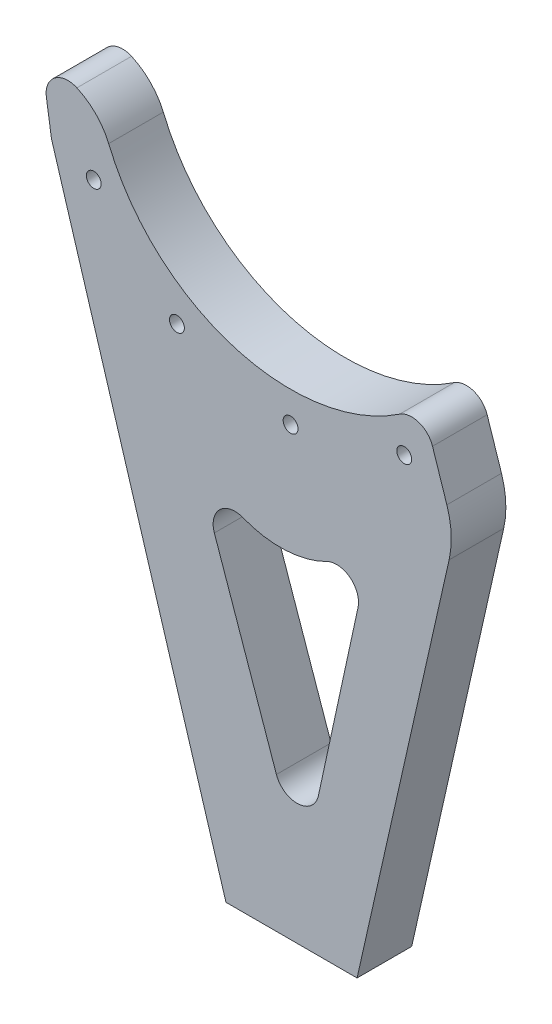
ISO-10303-21;
HEADER;
FILE_DESCRIPTION(('STEP AP214'),'2;1');
FILE_NAME('part.step','',(''),(''),'','','');
FILE_SCHEMA(('AUTOMOTIVE_DESIGN { 1 0 10303 214 1 1 1 1 }'));
ENDSEC;
DATA;
#1=APPLICATION_CONTEXT('core data for automotive mechanical design processes');
#2=APPLICATION_PROTOCOL_DEFINITION('international standard','automotive_design',2000,#1);
#3=PRODUCT_CONTEXT('',#1,'mechanical');
#4=PRODUCT('Part','Part','',(#3));
#5=PRODUCT_RELATED_PRODUCT_CATEGORY('part','',(#4));
#6=PRODUCT_DEFINITION_FORMATION('','',#4);
#7=PRODUCT_DEFINITION_CONTEXT('part definition',#1,'design');
#8=PRODUCT_DEFINITION('design','',#6,#7);
#9=PRODUCT_DEFINITION_SHAPE('','',#8);
#10=(LENGTH_UNIT() NAMED_UNIT(*) SI_UNIT(.MILLI.,.METRE.));
#11=(NAMED_UNIT(*) PLANE_ANGLE_UNIT() SI_UNIT($,.RADIAN.));
#12=(NAMED_UNIT(*) SI_UNIT($,.STERADIAN.) SOLID_ANGLE_UNIT());
#13=UNCERTAINTY_MEASURE_WITH_UNIT(LENGTH_MEASURE(1.E-05),#10,'distance_accuracy_value','');
#14=(GEOMETRIC_REPRESENTATION_CONTEXT(3) GLOBAL_UNCERTAINTY_ASSIGNED_CONTEXT((#13)) GLOBAL_UNIT_ASSIGNED_CONTEXT((#10,
#11,#12)) REPRESENTATION_CONTEXT('',''));
#15=CARTESIAN_POINT('',(0.,0.,0.));
#16=DIRECTION('',(0.,0.,1.));
#17=DIRECTION('',(1.,0.,0.));
#18=AXIS2_PLACEMENT_3D('',#15,#16,#17);
#19=CARTESIAN_POINT('',(-54.7138623609049,-22.7011364023843,12.5));
#20=DIRECTION('',(0.,0.,-1.));
#21=DIRECTION('',(-1.,0.,0.));
#22=AXIS2_PLACEMENT_3D('',#19,#20,#21);
#23=CYLINDRICAL_SURFACE('',#22,14.2372163152668);
#24=CARTESIAN_POINT('',(-54.7138623609049,-22.7011364023843,0.));
#25=DIRECTION('',(0.,0.,1.));
#26=DIRECTION('',(1.,0.,0.));
#27=AXIS2_PLACEMENT_3D('',#24,#25,#26);
#28=CIRCLE('',#27,14.2372163152668);
#29=CARTESIAN_POINT('',(-48.8902864782956,-9.7094354996082,0.));
#30=VERTEX_POINT('',#29);
#31=CARTESIAN_POINT('',(-41.615847066396,-17.1207848227335,0.));
#32=VERTEX_POINT('',#31);
#33=EDGE_CURVE('E317',#30,#32,#28,.F.);
#34=ORIENTED_EDGE('',*,*,#33,.F.);
#35=DIRECTION('',(0.,0.,-1.));
#36=VECTOR('',#35,1.);
#37=CARTESIAN_POINT('',(-48.8902864782956,-9.7094354996082,12.5));
#38=LINE('',#37,#36);
#39=CARTESIAN_POINT('',(-48.8902864782956,-9.7094354996082,12.5));
#40=VERTEX_POINT('',#39);
#41=EDGE_CURVE('E196',#30,#40,#38,.F.);
#42=ORIENTED_EDGE('',*,*,#41,.T.);
#43=CARTESIAN_POINT('',(-54.7138623609049,-22.7011364023843,12.5));
#44=DIRECTION('',(0.,0.,1.));
#45=DIRECTION('',(1.,0.,0.));
#46=AXIS2_PLACEMENT_3D('',#43,#44,#45);
#47=CIRCLE('',#46,14.2372163152668);
#48=CARTESIAN_POINT('',(-41.615847066396,-17.1207848227335,12.5));
#49=VERTEX_POINT('',#48);
#50=EDGE_CURVE('E296',#40,#49,#47,.F.);
#51=ORIENTED_EDGE('',*,*,#50,.T.);
#52=DIRECTION('',(0.,0.,-1.));
#53=VECTOR('',#52,1.);
#54=CARTESIAN_POINT('',(-41.615847066396,-17.1207848227335,12.5));
#55=LINE('',#54,#53);
#56=EDGE_CURVE('E191',#49,#32,#55,.T.);
#57=ORIENTED_EDGE('',*,*,#56,.T.);
#58=EDGE_LOOP('',(#34,#42,#51,#57));
#59=FACE_BOUND('',#58,.T.);
#60=ADVANCED_FACE('F39',(#59),#23,.T.);
#61=CARTESIAN_POINT('',(-56.8494448081949,-8.62499999999999,12.5));
#62=DIRECTION('',(0.988685996664259,0.15,0.));
#63=DIRECTION('',(-0.15,0.98868599666426,0.));
#64=AXIS2_PLACEMENT_3D('',#61,#62,#63);
#65=PLANE('',#64);
#66=DIRECTION('',(0.15,-0.988685996664259,0.));
#67=VECTOR('',#66,1.);
#68=CARTESIAN_POINT('',(-56.8494448081949,-8.62499999999999,0.));
#69=LINE('',#68,#67);
#70=CARTESIAN_POINT('',(-55.8789111659934,-15.0220201422412,0.));
#71=VERTEX_POINT('',#70);
#72=CARTESIAN_POINT('',(-54.768159762617,-22.3432491975308,0.));
#73=VERTEX_POINT('',#72);
#74=EDGE_CURVE('E319',#71,#73,#69,.T.);
#75=ORIENTED_EDGE('',*,*,#74,.T.);
#76=DIRECTION('',(0.,0.,-1.));
#77=VECTOR('',#76,1.);
#78=CARTESIAN_POINT('',(-54.768159762617,-22.3432491975308,12.5));
#79=LINE('',#78,#77);
#80=CARTESIAN_POINT('',(-54.768159762617,-22.3432491975308,12.5));
#81=VERTEX_POINT('',#80);
#82=EDGE_CURVE('E204',#73,#81,#79,.F.);
#83=ORIENTED_EDGE('',*,*,#82,.T.);
#84=DIRECTION('',(0.15,-0.988685996664259,0.));
#85=VECTOR('',#84,1.);
#86=CARTESIAN_POINT('',(-56.8494448081949,-8.62499999999999,12.5));
#87=LINE('',#86,#85);
#88=CARTESIAN_POINT('',(-55.8789111659934,-15.0220201422412,12.5));
#89=VERTEX_POINT('',#88);
#90=EDGE_CURVE('E171',#89,#81,#87,.T.);
#91=ORIENTED_EDGE('',*,*,#90,.F.);
#92=DIRECTION('',(0.,0.,1.));
#93=VECTOR('',#92,1.);
#94=CARTESIAN_POINT('',(-55.8789111659934,-15.0220201422412,0.));
#95=LINE('',#94,#93);
#96=EDGE_CURVE('E186',#89,#71,#95,.F.);
#97=ORIENTED_EDGE('',*,*,#96,.T.);
#98=EDGE_LOOP('',(#75,#83,#91,#97));
#99=FACE_BOUND('',#98,.T.);
#100=ADVANCED_FACE('F351',(#99),#65,.F.);
#101=CARTESIAN_POINT('',(-56.4026672887645,-17.1455915858062,12.5));
#102=DIRECTION('',(0.956770396377433,0.290844303048504,0.));
#103=DIRECTION('',(-0.290844303048504,0.956770396377433,0.));
#104=AXIS2_PLACEMENT_3D('',#101,#102,#103);
#105=PLANE('',#104);
#106=DIRECTION('',(0.290844303048504,-0.956770396377433,0.));
#107=VECTOR('',#106,1.);
#108=CARTESIAN_POINT('',(-56.4026672887645,-17.1455915858062,12.5));
#109=LINE('',#108,#107);
#110=CARTESIAN_POINT('',(-54.6085817611829,-23.0474707127733,12.5));
#111=VERTEX_POINT('',#110);
#112=CARTESIAN_POINT('',(-14.7864224142408,-154.047675233283,12.5));
#113=VERTEX_POINT('',#112);
#114=EDGE_CURVE('E158',#111,#113,#109,.T.);
#115=ORIENTED_EDGE('',*,*,#114,.F.);
#116=DIRECTION('',(0.,0.,-1.));
#117=VECTOR('',#116,1.);
#118=CARTESIAN_POINT('',(-54.6085817611829,-23.0474707127733,12.5));
#119=LINE('',#118,#117);
#120=CARTESIAN_POINT('',(-54.6085817611829,-23.0474707127733,0.));
#121=VERTEX_POINT('',#120);
#122=EDGE_CURVE('E200',#111,#121,#119,.T.);
#123=ORIENTED_EDGE('',*,*,#122,.T.);
#124=DIRECTION('',(0.290844303048504,-0.956770396377433,0.));
#125=VECTOR('',#124,1.);
#126=CARTESIAN_POINT('',(-56.4026672887645,-17.1455915858062,0.));
#127=LINE('',#126,#125);
#128=CARTESIAN_POINT('',(-14.7864224142408,-154.047675233283,0.));
#129=VERTEX_POINT('',#128);
#130=EDGE_CURVE('E184',#121,#129,#127,.T.);
#131=ORIENTED_EDGE('',*,*,#130,.T.);
#132=DIRECTION('',(0.,0.,-1.));
#133=VECTOR('',#132,1.);
#134=CARTESIAN_POINT('',(-14.7864224142408,-154.047675233283,12.5));
#135=LINE('',#134,#133);
#136=EDGE_CURVE('E177',#113,#129,#135,.T.);
#137=ORIENTED_EDGE('',*,*,#136,.F.);
#138=EDGE_LOOP('',(#115,#123,#131,#137));
#139=FACE_BOUND('',#138,.T.);
#140=ADVANCED_FACE('F182',(#139),#105,.F.);
#141=CARTESIAN_POINT('',(0.,-154.047675233283,12.5));
#142=DIRECTION('',(0.,1.,0.));
#143=DIRECTION('',(0.,0.,1.));
#144=AXIS2_PLACEMENT_3D('',#141,#142,#143);
#145=PLANE('',#144);
#146=CARTESIAN_POINT('',(0.213577585759191,-154.047675233283,6.25));
#147=DIRECTION('',(0.,-1.,0.));
#148=DIRECTION('',(0.,0.,-1.));
#149=AXIS2_PLACEMENT_3D('',#146,#147,#148);
#150=CIRCLE('',#149,1.745);
#151=CARTESIAN_POINT('',(0.213577585759191,-154.047675233283,4.505));
#152=VERTEX_POINT('',#151);
#153=EDGE_CURVE('E276',#152,#152,#150,.T.);
#154=ORIENTED_EDGE('',*,*,#153,.F.);
#155=EDGE_LOOP('',(#154));
#156=FACE_BOUND('',#155,.T.);
#157=DIRECTION('',(1.,0.,0.));
#158=VECTOR('',#157,1.);
#159=CARTESIAN_POINT('',(0.,-154.047675233283,0.));
#160=LINE('',#159,#158);
#161=CARTESIAN_POINT('',(15.2135775857592,-154.047675233283,0.));
#162=VERTEX_POINT('',#161);
#163=EDGE_CURVE('E323',#129,#162,#160,.T.);
#164=ORIENTED_EDGE('',*,*,#163,.T.);
#165=DIRECTION('',(0.,0.,-1.));
#166=VECTOR('',#165,1.);
#167=CARTESIAN_POINT('',(15.2135775857592,-154.047675233283,12.5));
#168=LINE('',#167,#166);
#169=CARTESIAN_POINT('',(15.2135775857592,-154.047675233283,12.5));
#170=VERTEX_POINT('',#169);
#171=EDGE_CURVE('E179',#170,#162,#168,.T.);
#172=ORIENTED_EDGE('',*,*,#171,.F.);
#173=DIRECTION('',(1.,0.,0.));
#174=VECTOR('',#173,1.);
#175=CARTESIAN_POINT('',(0.,-154.047675233283,12.5));
#176=LINE('',#175,#174);
#177=EDGE_CURVE('E162',#113,#170,#176,.T.);
#178=ORIENTED_EDGE('',*,*,#177,.F.);
#179=ORIENTED_EDGE('',*,*,#136,.T.);
#180=EDGE_LOOP('',(#164,#172,#178,#179));
#181=FACE_BOUND('',#180,.T.);
#182=ADVANCED_FACE('F176',(#156,#181),#145,.F.);
#183=CARTESIAN_POINT('',(47.5350610573209,-10.7194797590249,12.5));
#184=DIRECTION('',(0.975503764817169,-0.219982737567133,0.));
#185=DIRECTION('',(0.219982737567133,0.975503764817169,0.));
#186=AXIS2_PLACEMENT_3D('',#183,#184,#185);
#187=PLANE('',#186);
#188=DIRECTION('',(-0.219982737567133,-0.975503764817169,0.));
#189=VECTOR('',#188,1.);
#190=CARTESIAN_POINT('',(47.5350610573209,-10.7194797590249,0.));
#191=LINE('',#190,#189);
#192=CARTESIAN_POINT('',(36.2715223477053,-60.6671462800888,0.));
#193=VERTEX_POINT('',#192);
#194=EDGE_CURVE('E325',#193,#162,#191,.T.);
#195=ORIENTED_EDGE('',*,*,#194,.F.);
#196=DIRECTION('',(0.,0.,-1.));
#197=VECTOR('',#196,1.);
#198=CARTESIAN_POINT('',(36.2715223477053,-60.6671462800888,12.5));
#199=LINE('',#198,#197);
#200=CARTESIAN_POINT('',(36.2715223477053,-60.6671462800888,12.5));
#201=VERTEX_POINT('',#200);
#202=EDGE_CURVE('E221',#193,#201,#199,.F.);
#203=ORIENTED_EDGE('',*,*,#202,.T.);
#204=DIRECTION('',(-0.219982737567133,-0.975503764817169,0.));
#205=VECTOR('',#204,1.);
#206=CARTESIAN_POINT('',(47.5350610573209,-10.7194797590249,12.5));
#207=LINE('',#206,#205);
#208=EDGE_CURVE('E180',#201,#170,#207,.T.);
#209=ORIENTED_EDGE('',*,*,#208,.T.);
#210=ORIENTED_EDGE('',*,*,#171,.T.);
#211=EDGE_LOOP('',(#195,#203,#209,#210));
#212=FACE_BOUND('',#211,.T.);
#213=ADVANCED_FACE('F358',(#212),#187,.T.);
#214=CARTESIAN_POINT('',(17.4063399147888,5.73054468982779,12.5));
#215=DIRECTION('',(0.949848417268267,0.312710703707066,0.));
#216=DIRECTION('',(-0.312710703707066,0.949848417268267,0.));
#217=AXIS2_PLACEMENT_3D('',#214,#215,#216);
#218=PLANE('',#217);
#219=DIRECTION('',(0.312710703707066,-0.949848417268267,0.));
#220=VECTOR('',#219,1.);
#221=CARTESIAN_POINT('',(17.4063399147888,5.73054468982779,12.5));
#222=LINE('',#221,#220);
#223=CARTESIAN_POINT('',(32.476381225641,-40.0442072377216,12.5));
#224=VERTEX_POINT('',#223);
#225=CARTESIAN_POINT('',(35.7584153967273,-50.0132774546048,12.5));
#226=VERTEX_POINT('',#225);
#227=EDGE_CURVE('E300',#224,#226,#222,.T.);
#228=ORIENTED_EDGE('',*,*,#227,.T.);
#229=DIRECTION('',(0.,0.,-1.));
#230=VECTOR('',#229,1.);
#231=CARTESIAN_POINT('',(35.7584153967273,-50.0132774546048,12.5));
#232=LINE('',#231,#230);
#233=CARTESIAN_POINT('',(35.7584153967273,-50.0132774546048,0.));
#234=VERTEX_POINT('',#233);
#235=EDGE_CURVE('E216',#226,#234,#232,.T.);
#236=ORIENTED_EDGE('',*,*,#235,.T.);
#237=DIRECTION('',(0.312710703707066,-0.949848417268267,0.));
#238=VECTOR('',#237,1.);
#239=CARTESIAN_POINT('',(17.4063399147888,5.73054468982779,0.));
#240=LINE('',#239,#238);
#241=CARTESIAN_POINT('',(32.476381225641,-40.0442072377216,0.));
#242=VERTEX_POINT('',#241);
#243=EDGE_CURVE('E327',#242,#234,#240,.T.);
#244=ORIENTED_EDGE('',*,*,#243,.F.);
#245=DIRECTION('',(0.,0.,-1.));
#246=VECTOR('',#245,1.);
#247=CARTESIAN_POINT('',(32.476381225641,-40.0442072377216,12.5));
#248=LINE('',#247,#246);
#249=EDGE_CURVE('E212',#242,#224,#248,.F.);
#250=ORIENTED_EDGE('',*,*,#249,.T.);
#251=EDGE_LOOP('',(#228,#236,#244,#250));
#252=FACE_BOUND('',#251,.T.);
#253=ADVANCED_FACE('F365',(#252),#218,.T.);
#254=CARTESIAN_POINT('',(-1.81557029619843E-13,-52.,12.5));
#255=DIRECTION('',(0.,0.,-1.));
#256=DIRECTION('',(-1.,0.,0.));
#257=AXIS2_PLACEMENT_3D('',#254,#255,#256);
#258=CYLINDRICAL_SURFACE('',#257,1.7);
#259=CARTESIAN_POINT('',(-1.81557029619843E-13,-52.,12.5));
#260=DIRECTION('',(0.,0.,1.));
#261=DIRECTION('',(1.,0.,0.));
#262=AXIS2_PLACEMENT_3D('',#259,#260,#261);
#263=CIRCLE('',#262,1.7);
#264=CARTESIAN_POINT('',(1.69999999999982,-52.,12.5));
#265=VERTEX_POINT('',#264);
#266=EDGE_CURVE('E293',#265,#265,#263,.T.);
#267=ORIENTED_EDGE('',*,*,#266,.T.);
#268=EDGE_LOOP('',(#267));
#269=FACE_BOUND('',#268,.T.);
#270=CARTESIAN_POINT('',(-1.81557029619843E-13,-52.,0.));
#271=DIRECTION('',(0.,0.,1.));
#272=DIRECTION('',(1.,0.,0.));
#273=AXIS2_PLACEMENT_3D('',#270,#271,#272);
#274=CIRCLE('',#273,1.7);
#275=CARTESIAN_POINT('',(1.69999999999982,-52.,0.));
#276=VERTEX_POINT('',#275);
#277=EDGE_CURVE('E314',#276,#276,#274,.T.);
#278=ORIENTED_EDGE('',*,*,#277,.F.);
#279=EDGE_LOOP('',(#278));
#280=FACE_BOUND('',#279,.T.);
#281=ADVANCED_FACE('F387',(#269,#280),#258,.F.);
#282=CARTESIAN_POINT('',(-26.0000000000002,-45.0333209967907,12.5));
#283=DIRECTION('',(0.,0.,-1.));
#284=DIRECTION('',(-1.,0.,0.));
#285=AXIS2_PLACEMENT_3D('',#282,#283,#284);
#286=CYLINDRICAL_SURFACE('',#285,1.7);
#287=CARTESIAN_POINT('',(-26.0000000000002,-45.0333209967907,12.5));
#288=DIRECTION('',(0.,0.,1.));
#289=DIRECTION('',(1.,0.,0.));
#290=AXIS2_PLACEMENT_3D('',#287,#288,#289);
#291=CIRCLE('',#290,1.7);
#292=CARTESIAN_POINT('',(-24.3000000000002,-45.0333209967907,12.5));
#293=VERTEX_POINT('',#292);
#294=EDGE_CURVE('E290',#293,#293,#291,.T.);
#295=ORIENTED_EDGE('',*,*,#294,.T.);
#296=EDGE_LOOP('',(#295));
#297=FACE_BOUND('',#296,.T.);
#298=CARTESIAN_POINT('',(-26.0000000000002,-45.0333209967907,0.));
#299=DIRECTION('',(0.,0.,1.));
#300=DIRECTION('',(1.,0.,0.));
#301=AXIS2_PLACEMENT_3D('',#298,#299,#300);
#302=CIRCLE('',#301,1.7);
#303=CARTESIAN_POINT('',(-24.3000000000002,-45.0333209967907,0.));
#304=VERTEX_POINT('',#303);
#305=EDGE_CURVE('E311',#304,#304,#302,.T.);
#306=ORIENTED_EDGE('',*,*,#305,.F.);
#307=EDGE_LOOP('',(#306));
#308=FACE_BOUND('',#307,.T.);
#309=ADVANCED_FACE('F390',(#297,#308),#286,.F.);
#310=CARTESIAN_POINT('',(-45.033320996791,-25.9999999999997,12.5));
#311=DIRECTION('',(0.,0.,-1.));
#312=DIRECTION('',(-1.,0.,0.));
#313=AXIS2_PLACEMENT_3D('',#310,#311,#312);
#314=CYLINDRICAL_SURFACE('',#313,1.69999999999999);
#315=CARTESIAN_POINT('',(-45.033320996791,-25.9999999999997,12.5));
#316=DIRECTION('',(0.,0.,1.));
#317=DIRECTION('',(1.,0.,0.));
#318=AXIS2_PLACEMENT_3D('',#315,#316,#317);
#319=CIRCLE('',#318,1.69999999999999);
#320=CARTESIAN_POINT('',(-43.333320996791,-25.9999999999997,12.5));
#321=VERTEX_POINT('',#320);
#322=EDGE_CURVE('E286',#321,#321,#319,.T.);
#323=ORIENTED_EDGE('',*,*,#322,.T.);
#324=EDGE_LOOP('',(#323));
#325=FACE_BOUND('',#324,.T.);
#326=CARTESIAN_POINT('',(-45.033320996791,-25.9999999999997,0.));
#327=DIRECTION('',(0.,0.,1.));
#328=DIRECTION('',(1.,0.,0.));
#329=AXIS2_PLACEMENT_3D('',#326,#327,#328);
#330=CIRCLE('',#329,1.69999999999999);
#331=CARTESIAN_POINT('',(-43.333320996791,-25.9999999999997,0.));
#332=VERTEX_POINT('',#331);
#333=EDGE_CURVE('E308',#332,#332,#330,.T.);
#334=ORIENTED_EDGE('',*,*,#333,.F.);
#335=EDGE_LOOP('',(#334));
#336=FACE_BOUND('',#335,.T.);
#337=ADVANCED_FACE('F394',(#325,#336),#314,.F.);
#338=CARTESIAN_POINT('',(25.9999999999993,-45.0333209967912,12.5));
#339=DIRECTION('',(0.,0.,-1.));
#340=DIRECTION('',(-1.,0.,0.));
#341=AXIS2_PLACEMENT_3D('',#338,#339,#340);
#342=CYLINDRICAL_SURFACE('',#341,1.69999999999999);
#343=CARTESIAN_POINT('',(25.9999999999993,-45.0333209967912,12.5));
#344=DIRECTION('',(0.,0.,1.));
#345=DIRECTION('',(1.,0.,0.));
#346=AXIS2_PLACEMENT_3D('',#343,#344,#345);
#347=CIRCLE('',#346,1.69999999999999);
#348=CARTESIAN_POINT('',(27.6999999999993,-45.0333209967912,12.5));
#349=VERTEX_POINT('',#348);
#350=EDGE_CURVE('E283',#349,#349,#347,.T.);
#351=ORIENTED_EDGE('',*,*,#350,.T.);
#352=EDGE_LOOP('',(#351));
#353=FACE_BOUND('',#352,.T.);
#354=CARTESIAN_POINT('',(25.9999999999993,-45.0333209967912,0.));
#355=DIRECTION('',(0.,0.,1.));
#356=DIRECTION('',(1.,0.,0.));
#357=AXIS2_PLACEMENT_3D('',#354,#355,#356);
#358=CIRCLE('',#357,1.69999999999999);
#359=CARTESIAN_POINT('',(27.6999999999993,-45.0333209967912,0.));
#360=VERTEX_POINT('',#359);
#361=EDGE_CURVE('E280',#360,#360,#358,.T.);
#362=ORIENTED_EDGE('',*,*,#361,.F.);
#363=EDGE_LOOP('',(#362));
#364=FACE_BOUND('',#363,.T.);
#365=ADVANCED_FACE('F398',(#353,#364),#342,.F.);
#366=CARTESIAN_POINT('',(0.,0.,12.5));
#367=DIRECTION('',(0.,0.,-1.));
#368=DIRECTION('',(-1.,0.,0.));
#369=AXIS2_PLACEMENT_3D('',#366,#367,#368);
#370=CYLINDRICAL_SURFACE('',#369,45.);
#371=CARTESIAN_POINT('',(0.,0.,12.5));
#372=DIRECTION('',(0.,0.,1.));
#373=DIRECTION('',(1.,0.,0.));
#374=AXIS2_PLACEMENT_3D('',#371,#372,#373);
#375=CIRCLE('',#374,45.);
#376=CARTESIAN_POINT('',(24.9544252253697,-37.4469846806313,12.5));
#377=VERTEX_POINT('',#376);
#378=EDGE_CURVE('E303',#49,#377,#375,.T.);
#379=ORIENTED_EDGE('',*,*,#378,.T.);
#380=DIRECTION('',(0.,0.,-1.));
#381=VECTOR('',#380,1.);
#382=CARTESIAN_POINT('',(24.9544252253697,-37.4469846806313,12.5));
#383=LINE('',#382,#381);
#384=CARTESIAN_POINT('',(24.9544252253697,-37.4469846806313,0.));
#385=VERTEX_POINT('',#384);
#386=EDGE_CURVE('E207',#377,#385,#383,.T.);
#387=ORIENTED_EDGE('',*,*,#386,.T.);
#388=CARTESIAN_POINT('',(0.,0.,0.));
#389=DIRECTION('',(0.,0.,1.));
#390=DIRECTION('',(1.,0.,0.));
#391=AXIS2_PLACEMENT_3D('',#388,#389,#390);
#392=CIRCLE('',#391,45.);
#393=EDGE_CURVE('E287',#32,#385,#392,.T.);
#394=ORIENTED_EDGE('',*,*,#393,.F.);
#395=ORIENTED_EDGE('',*,*,#56,.F.);
#396=EDGE_LOOP('',(#379,#387,#394,#395));
#397=FACE_BOUND('',#396,.T.);
#398=ADVANCED_FACE('F340',(#397),#370,.F.);
#399=CARTESIAN_POINT('',(0.,0.,12.5));
#400=DIRECTION('',(0.,0.,1.));
#401=DIRECTION('',(1.,0.,0.));
#402=AXIS2_PLACEMENT_3D('',#399,#400,#401);
#403=PLANE('',#402);
#404=CARTESIAN_POINT('',(-2.30906107091263,-53.9093470840644,12.5));
#405=DIRECTION('',(0.,0.,1.));
#406=DIRECTION('',(1.,0.,0.));
#407=AXIS2_PLACEMENT_3D('',#404,#405,#406);
#408=CIRCLE('',#407,23.5928240391497);
#409=CARTESIAN_POINT('',(8.30083770456595,-74.9818740828935,12.5));
#410=VERTEX_POINT('',#409);
#411=CARTESIAN_POINT('',(-10.9005304587112,-75.8822394722049,12.5));
#412=VERTEX_POINT('',#411);
#413=EDGE_CURVE('E269',#410,#412,#408,.F.);
#414=ORIENTED_EDGE('',*,*,#413,.F.);
#415=CARTESIAN_POINT('',(10.5493813205978,-79.4477504366232,12.5));
#416=DIRECTION('',(0.,0.,1.));
#417=DIRECTION('',(1.,0.,0.));
#418=AXIS2_PLACEMENT_3D('',#415,#416,#417);
#419=CIRCLE('',#418,5.);
#420=CARTESIAN_POINT('',(15.4359448330949,-80.506758008991,12.5));
#421=VERTEX_POINT('',#420);
#422=EDGE_CURVE('E11',#410,#421,#419,.F.);
#423=ORIENTED_EDGE('',*,*,#422,.T.);
#424=DIRECTION('',(0.211801514473557,0.977312702499414,0.));
#425=VECTOR('',#424,1.);
#426=CARTESIAN_POINT('',(31.4080920549967,-6.80670725650084,12.5));
#427=LINE('',#426,#425);
#428=CARTESIAN_POINT('',(6.36522513412014,-122.36165033426,12.5));
#429=VERTEX_POINT('',#428);
#430=EDGE_CURVE('E263',#429,#421,#427,.T.);
#431=ORIENTED_EDGE('',*,*,#430,.F.);
#432=CARTESIAN_POINT('',(1.47866162162309,-121.302642761892,12.5));
#433=DIRECTION('',(0.,0.,1.));
#434=DIRECTION('',(1.,0.,0.));
#435=AXIS2_PLACEMENT_3D('',#432,#433,#434);
#436=CIRCLE('',#435,5.);
#437=CARTESIAN_POINT('',(-3.24305669154038,-122.947445537649,12.5));
#438=VERTEX_POINT('',#437);
#439=EDGE_CURVE('E233',#429,#438,#436,.F.);
#440=ORIENTED_EDGE('',*,*,#439,.T.);
#441=DIRECTION('',(0.328960555151328,-0.944343662632693,0.));
#442=VECTOR('',#441,1.);
#443=CARTESIAN_POINT('',(-41.0859563287347,-14.3122250274271,12.5));
#444=LINE('',#443,#442);
#445=CARTESIAN_POINT('',(-17.4430289746901,-82.1837320006759,12.5));
#446=VERTEX_POINT('',#445);
#447=EDGE_CURVE('E266',#446,#438,#444,.T.);
#448=ORIENTED_EDGE('',*,*,#447,.F.);
#449=CARTESIAN_POINT('',(-12.7213106615267,-80.5389292249193,12.5));
#450=DIRECTION('',(0.,0.,1.));
#451=DIRECTION('',(1.,0.,0.));
#452=AXIS2_PLACEMENT_3D('',#449,#450,#451);
#453=CIRCLE('',#452,5.);
#454=EDGE_CURVE('E247',#446,#412,#453,.F.);
#455=ORIENTED_EDGE('',*,*,#454,.T.);
#456=EDGE_LOOP('',(#414,#423,#431,#440,#448,#455));
#457=FACE_BOUND('',#456,.T.);
#458=ORIENTED_EDGE('',*,*,#350,.F.);
#459=EDGE_LOOP('',(#458));
#460=FACE_BOUND('',#459,.T.);
#461=ORIENTED_EDGE('',*,*,#322,.F.);
#462=EDGE_LOOP('',(#461));
#463=FACE_BOUND('',#462,.T.);
#464=ORIENTED_EDGE('',*,*,#294,.F.);
#465=EDGE_LOOP('',(#464));
#466=FACE_BOUND('',#465,.T.);
#467=ORIENTED_EDGE('',*,*,#266,.F.);
#468=EDGE_LOOP('',(#467));
#469=FACE_BOUND('',#468,.T.);
#470=ORIENTED_EDGE('',*,*,#208,.F.);
#471=CARTESIAN_POINT('',(16.761447051362,-56.2674915287462,12.5));
#472=DIRECTION('',(0.,0.,1.));
#473=DIRECTION('',(1.,0.,0.));
#474=AXIS2_PLACEMENT_3D('',#471,#472,#473);
#475=CIRCLE('',#474,20.);
#476=EDGE_CURVE('E223',#201,#226,#475,.T.);
#477=ORIENTED_EDGE('',*,*,#476,.T.);
#478=ORIENTED_EDGE('',*,*,#227,.F.);
#479=CARTESIAN_POINT('',(27.7271391392997,-41.607760756257,12.5));
#480=DIRECTION('',(0.,0.,1.));
#481=DIRECTION('',(1.,0.,0.));
#482=AXIS2_PLACEMENT_3D('',#479,#480,#481);
#483=CIRCLE('',#482,5.);
#484=EDGE_CURVE('E214',#224,#377,#483,.T.);
#485=ORIENTED_EDGE('',*,*,#484,.T.);
#486=ORIENTED_EDGE('',*,*,#378,.F.);
#487=ORIENTED_EDGE('',*,*,#50,.F.);
#488=CARTESIAN_POINT('',(-50.9354811826721,-14.2720201422412,12.5));
#489=DIRECTION('',(0.,0.,1.));
#490=DIRECTION('',(1.,0.,0.));
#491=AXIS2_PLACEMENT_3D('',#488,#489,#490);
#492=CIRCLE('',#491,5.);
#493=EDGE_CURVE('E198',#40,#89,#492,.T.);
#494=ORIENTED_EDGE('',*,*,#493,.T.);
#495=ORIENTED_EDGE('',*,*,#90,.T.);
#496=CARTESIAN_POINT('',(-49.8247297792957,-21.5932491975308,12.5));
#497=DIRECTION('',(0.,0.,1.));
#498=DIRECTION('',(1.,0.,0.));
#499=AXIS2_PLACEMENT_3D('',#496,#497,#498);
#500=CIRCLE('',#499,5.);
#501=EDGE_CURVE('E166',#81,#111,#500,.T.);
#502=ORIENTED_EDGE('',*,*,#501,.T.);
#503=ORIENTED_EDGE('',*,*,#114,.T.);
#504=ORIENTED_EDGE('',*,*,#177,.T.);
#505=EDGE_LOOP('',(#470,#477,#478,#485,#486,#487,#494,#495,#502,#503,#504));
#506=FACE_BOUND('',#505,.T.);
#507=ADVANCED_FACE('F161',(#457,#460,#463,#466,#469,#506),#403,.T.);
#508=CARTESIAN_POINT('',(0.,0.,0.));
#509=DIRECTION('',(0.,0.,1.));
#510=DIRECTION('',(1.,0.,0.));
#511=AXIS2_PLACEMENT_3D('',#508,#509,#510);
#512=PLANE('',#511);
#513=DIRECTION('',(-0.211801514473557,-0.977312702499414,0.));
#514=VECTOR('',#513,1.);
#515=CARTESIAN_POINT('',(19.010121999484,-64.0144833697952,0.));
#516=LINE('',#515,#514);
#517=CARTESIAN_POINT('',(15.4359448330949,-80.506758008991,0.));
#518=VERTEX_POINT('',#517);
#519=CARTESIAN_POINT('',(6.36522513412015,-122.36165033426,0.));
#520=VERTEX_POINT('',#519);
#521=EDGE_CURVE('E255',#518,#520,#516,.T.);
#522=ORIENTED_EDGE('',*,*,#521,.F.);
#523=CARTESIAN_POINT('',(10.5493813205978,-79.4477504366232,0.));
#524=DIRECTION('',(0.,0.,1.));
#525=DIRECTION('',(1.,0.,0.));
#526=AXIS2_PLACEMENT_3D('',#523,#524,#525);
#527=CIRCLE('',#526,5.);
#528=CARTESIAN_POINT('',(8.30083770456595,-74.9818740828935,0.));
#529=VERTEX_POINT('',#528);
#530=EDGE_CURVE('E47',#518,#529,#527,.T.);
#531=ORIENTED_EDGE('',*,*,#530,.T.);
#532=CARTESIAN_POINT('',(-2.30906107091263,-53.9093470840644,0.));
#533=DIRECTION('',(0.,0.,1.));
#534=DIRECTION('',(1.,0.,0.));
#535=AXIS2_PLACEMENT_3D('',#532,#533,#534);
#536=CIRCLE('',#535,23.5928240391497);
#537=CARTESIAN_POINT('',(-10.9005304587112,-75.8822394722049,0.));
#538=VERTEX_POINT('',#537);
#539=EDGE_CURVE('E254',#538,#529,#536,.T.);
#540=ORIENTED_EDGE('',*,*,#539,.F.);
#541=CARTESIAN_POINT('',(-12.7213106615267,-80.5389292249193,0.));
#542=DIRECTION('',(0.,0.,1.));
#543=DIRECTION('',(1.,0.,0.));
#544=AXIS2_PLACEMENT_3D('',#541,#542,#543);
#545=CIRCLE('',#544,5.);
#546=CARTESIAN_POINT('',(-17.4430289746901,-82.1837320006759,0.));
#547=VERTEX_POINT('',#546);
#548=EDGE_CURVE('E245',#538,#547,#545,.T.);
#549=ORIENTED_EDGE('',*,*,#548,.T.);
#550=DIRECTION('',(-0.328960555151328,0.944343662632693,0.));
#551=VECTOR('',#550,1.);
#552=CARTESIAN_POINT('',(2.60192745391244,-139.726581058647,0.));
#553=LINE('',#552,#551);
#554=CARTESIAN_POINT('',(-3.24305669154038,-122.947445537649,0.));
#555=VERTEX_POINT('',#554);
#556=EDGE_CURVE('E267',#555,#547,#553,.T.);
#557=ORIENTED_EDGE('',*,*,#556,.F.);
#558=CARTESIAN_POINT('',(1.47866162162309,-121.302642761892,0.));
#559=DIRECTION('',(0.,0.,1.));
#560=DIRECTION('',(1.,0.,0.));
#561=AXIS2_PLACEMENT_3D('',#558,#559,#560);
#562=CIRCLE('',#561,5.);
#563=EDGE_CURVE('E230',#555,#520,#562,.T.);
#564=ORIENTED_EDGE('',*,*,#563,.T.);
#565=EDGE_LOOP('',(#522,#531,#540,#549,#557,#564));
#566=FACE_BOUND('',#565,.T.);
#567=ORIENTED_EDGE('',*,*,#361,.T.);
#568=EDGE_LOOP('',(#567));
#569=FACE_BOUND('',#568,.T.);
#570=ORIENTED_EDGE('',*,*,#333,.T.);
#571=EDGE_LOOP('',(#570));
#572=FACE_BOUND('',#571,.T.);
#573=ORIENTED_EDGE('',*,*,#305,.T.);
#574=EDGE_LOOP('',(#573));
#575=FACE_BOUND('',#574,.T.);
#576=ORIENTED_EDGE('',*,*,#277,.T.);
#577=EDGE_LOOP('',(#576));
#578=FACE_BOUND('',#577,.T.);
#579=ORIENTED_EDGE('',*,*,#243,.T.);
#580=CARTESIAN_POINT('',(16.761447051362,-56.2674915287462,0.));
#581=DIRECTION('',(0.,0.,1.));
#582=DIRECTION('',(1.,0.,0.));
#583=AXIS2_PLACEMENT_3D('',#580,#581,#582);
#584=CIRCLE('',#583,20.);
#585=EDGE_CURVE('E219',#234,#193,#584,.F.);
#586=ORIENTED_EDGE('',*,*,#585,.T.);
#587=ORIENTED_EDGE('',*,*,#194,.T.);
#588=ORIENTED_EDGE('',*,*,#163,.F.);
#589=ORIENTED_EDGE('',*,*,#130,.F.);
#590=CARTESIAN_POINT('',(-49.8247297792957,-21.5932491975308,0.));
#591=DIRECTION('',(0.,0.,1.));
#592=DIRECTION('',(1.,0.,0.));
#593=AXIS2_PLACEMENT_3D('',#590,#591,#592);
#594=CIRCLE('',#593,5.);
#595=EDGE_CURVE('E202',#121,#73,#594,.F.);
#596=ORIENTED_EDGE('',*,*,#595,.T.);
#597=ORIENTED_EDGE('',*,*,#74,.F.);
#598=CARTESIAN_POINT('',(-50.9354811826721,-14.2720201422412,0.));
#599=DIRECTION('',(0.,0.,1.));
#600=DIRECTION('',(1.,0.,0.));
#601=AXIS2_PLACEMENT_3D('',#598,#599,#600);
#602=CIRCLE('',#601,5.);
#603=EDGE_CURVE('E189',#71,#30,#602,.F.);
#604=ORIENTED_EDGE('',*,*,#603,.T.);
#605=ORIENTED_EDGE('',*,*,#33,.T.);
#606=ORIENTED_EDGE('',*,*,#393,.T.);
#607=CARTESIAN_POINT('',(27.7271391392997,-41.607760756257,0.));
#608=DIRECTION('',(0.,0.,1.));
#609=DIRECTION('',(1.,0.,0.));
#610=AXIS2_PLACEMENT_3D('',#607,#608,#609);
#611=CIRCLE('',#610,5.);
#612=EDGE_CURVE('E210',#385,#242,#611,.F.);
#613=ORIENTED_EDGE('',*,*,#612,.T.);
#614=EDGE_LOOP('',(#579,#586,#587,#588,#589,#596,#597,#604,#605,#606,#613));
#615=FACE_BOUND('',#614,.T.);
#616=ADVANCED_FACE('F252',(#566,#569,#572,#575,#578,#615),#512,.F.);
#617=CARTESIAN_POINT('',(-50.9354811826721,-14.2720201422412,12.5));
#618=DIRECTION('',(0.,0.,-1.));
#619=DIRECTION('',(-1.,0.,0.));
#620=AXIS2_PLACEMENT_3D('',#617,#618,#619);
#621=CYLINDRICAL_SURFACE('',#620,5.);
#622=ORIENTED_EDGE('',*,*,#493,.F.);
#623=ORIENTED_EDGE('',*,*,#41,.F.);
#624=ORIENTED_EDGE('',*,*,#603,.F.);
#625=ORIENTED_EDGE('',*,*,#96,.F.);
#626=EDGE_LOOP('',(#622,#623,#624,#625));
#627=FACE_BOUND('',#626,.T.);
#628=ADVANCED_FACE('F348',(#627),#621,.T.);
#629=CARTESIAN_POINT('',(-49.8247297792957,-21.5932491975308,12.5));
#630=DIRECTION('',(0.,0.,-1.));
#631=DIRECTION('',(-1.,0.,0.));
#632=AXIS2_PLACEMENT_3D('',#629,#630,#631);
#633=CYLINDRICAL_SURFACE('',#632,5.);
#634=ORIENTED_EDGE('',*,*,#501,.F.);
#635=ORIENTED_EDGE('',*,*,#82,.F.);
#636=ORIENTED_EDGE('',*,*,#595,.F.);
#637=ORIENTED_EDGE('',*,*,#122,.F.);
#638=EDGE_LOOP('',(#634,#635,#636,#637));
#639=FACE_BOUND('',#638,.T.);
#640=ADVANCED_FACE('F354',(#639),#633,.T.);
#641=CARTESIAN_POINT('',(27.7271391392997,-41.607760756257,12.5));
#642=DIRECTION('',(0.,0.,-1.));
#643=DIRECTION('',(-1.,0.,0.));
#644=AXIS2_PLACEMENT_3D('',#641,#642,#643);
#645=CYLINDRICAL_SURFACE('',#644,5.);
#646=ORIENTED_EDGE('',*,*,#484,.F.);
#647=ORIENTED_EDGE('',*,*,#249,.F.);
#648=ORIENTED_EDGE('',*,*,#612,.F.);
#649=ORIENTED_EDGE('',*,*,#386,.F.);
#650=EDGE_LOOP('',(#646,#647,#648,#649));
#651=FACE_BOUND('',#650,.T.);
#652=ADVANCED_FACE('F369',(#651),#645,.T.);
#653=CARTESIAN_POINT('',(16.761447051362,-56.2674915287462,12.5));
#654=DIRECTION('',(0.,0.,-1.));
#655=DIRECTION('',(-1.,0.,0.));
#656=AXIS2_PLACEMENT_3D('',#653,#654,#655);
#657=CYLINDRICAL_SURFACE('',#656,20.);
#658=ORIENTED_EDGE('',*,*,#476,.F.);
#659=ORIENTED_EDGE('',*,*,#202,.F.);
#660=ORIENTED_EDGE('',*,*,#585,.F.);
#661=ORIENTED_EDGE('',*,*,#235,.F.);
#662=EDGE_LOOP('',(#658,#659,#660,#661));
#663=FACE_BOUND('',#662,.T.);
#664=ADVANCED_FACE('F363',(#663),#657,.T.);
#665=CARTESIAN_POINT('',(0.213577585759191,-144.047675233283,6.25));
#666=DIRECTION('',(0.,-1.,0.));
#667=DIRECTION('',(0.,0.,-1.));
#668=AXIS2_PLACEMENT_3D('',#665,#666,#667);
#669=CYLINDRICAL_SURFACE('',#668,1.745);
#670=CARTESIAN_POINT('',(0.213577585759191,-144.047675233283,6.25));
#671=DIRECTION('',(0.,-1.,0.));
#672=DIRECTION('',(0.,0.,-1.));
#673=AXIS2_PLACEMENT_3D('',#670,#671,#672);
#674=CIRCLE('',#673,1.745);
#675=CARTESIAN_POINT('',(0.213577585759191,-144.047675233283,4.505));
#676=VERTEX_POINT('',#675);
#677=EDGE_CURVE('E277',#676,#676,#674,.T.);
#678=ORIENTED_EDGE('',*,*,#677,.F.);
#679=EDGE_LOOP('',(#678));
#680=FACE_BOUND('',#679,.T.);
#681=ORIENTED_EDGE('',*,*,#153,.T.);
#682=EDGE_LOOP('',(#681));
#683=FACE_BOUND('',#682,.T.);
#684=ADVANCED_FACE('F376',(#680,#683),#669,.F.);
#685=CARTESIAN_POINT('',(0.213577585759191,-144.047675233283,6.25));
#686=DIRECTION('',(0.,-1.,0.));
#687=DIRECTION('',(0.,0.,-1.));
#688=AXIS2_PLACEMENT_3D('',#685,#686,#687);
#689=PLANE('',#688);
#690=ORIENTED_EDGE('',*,*,#677,.T.);
#691=EDGE_LOOP('',(#690));
#692=FACE_BOUND('',#691,.T.);
#693=ADVANCED_FACE('F487',(#692),#689,.T.);
#694=CARTESIAN_POINT('',(-2.30906107091263,-53.9093470840644,35.));
#695=DIRECTION('',(0.,0.,-1.));
#696=DIRECTION('',(-1.,0.,0.));
#697=AXIS2_PLACEMENT_3D('',#694,#695,#696);
#698=CYLINDRICAL_SURFACE('',#697,23.5928240391497);
#699=ORIENTED_EDGE('',*,*,#413,.T.);
#700=DIRECTION('',(0.,0.,-1.));
#701=VECTOR('',#700,1.);
#702=CARTESIAN_POINT('',(-10.9005304587112,-75.8822394722049,35.));
#703=LINE('',#702,#701);
#704=EDGE_CURVE('E238',#412,#538,#703,.T.);
#705=ORIENTED_EDGE('',*,*,#704,.T.);
#706=ORIENTED_EDGE('',*,*,#539,.T.);
#707=DIRECTION('',(0.,0.,-1.));
#708=VECTOR('',#707,1.);
#709=CARTESIAN_POINT('',(8.30083770456595,-74.9818740828935,35.));
#710=LINE('',#709,#708);
#711=EDGE_CURVE('E236',#529,#410,#710,.F.);
#712=ORIENTED_EDGE('',*,*,#711,.T.);
#713=EDGE_LOOP('',(#699,#705,#706,#712));
#714=FACE_BOUND('',#713,.T.);
#715=ADVANCED_FACE('F258',(#714),#698,.T.);
#716=CARTESIAN_POINT('',(2.60192745391244,-139.726581058647,35.));
#717=DIRECTION('',(-0.944343662632693,-0.328960555151328,0.));
#718=DIRECTION('',(0.328960555151328,-0.944343662632693,0.));
#719=AXIS2_PLACEMENT_3D('',#716,#717,#718);
#720=PLANE('',#719);
#721=ORIENTED_EDGE('',*,*,#556,.T.);
#722=DIRECTION('',(0.,0.,1.));
#723=VECTOR('',#722,1.);
#724=CARTESIAN_POINT('',(-17.4430289746901,-82.1837320006759,12.5));
#725=LINE('',#724,#723);
#726=EDGE_CURVE('E241',#547,#446,#725,.T.);
#727=ORIENTED_EDGE('',*,*,#726,.T.);
#728=ORIENTED_EDGE('',*,*,#447,.T.);
#729=DIRECTION('',(0.,0.,-1.));
#730=VECTOR('',#729,1.);
#731=CARTESIAN_POINT('',(-3.24305669154038,-122.947445537649,0.));
#732=LINE('',#731,#730);
#733=EDGE_CURVE('E225',#438,#555,#732,.T.);
#734=ORIENTED_EDGE('',*,*,#733,.T.);
#735=EDGE_LOOP('',(#721,#727,#728,#734));
#736=FACE_BOUND('',#735,.T.);
#737=ADVANCED_FACE('F486',(#736),#720,.F.);
#738=CARTESIAN_POINT('',(19.010121999484,-64.0144833697952,35.));
#739=DIRECTION('',(0.977312702499414,-0.211801514473557,0.));
#740=DIRECTION('',(0.211801514473557,0.977312702499414,0.));
#741=AXIS2_PLACEMENT_3D('',#738,#739,#740);
#742=PLANE('',#741);
#743=ORIENTED_EDGE('',*,*,#430,.T.);
#744=DIRECTION('',(0.,0.,1.));
#745=VECTOR('',#744,1.);
#746=CARTESIAN_POINT('',(15.4359448330949,-80.506758008991,0.));
#747=LINE('',#746,#745);
#748=EDGE_CURVE('E243',#421,#518,#747,.F.);
#749=ORIENTED_EDGE('',*,*,#748,.T.);
#750=ORIENTED_EDGE('',*,*,#521,.T.);
#751=DIRECTION('',(0.,0.,-1.));
#752=VECTOR('',#751,1.);
#753=CARTESIAN_POINT('',(6.36522513412016,-122.36165033426,12.5));
#754=LINE('',#753,#752);
#755=EDGE_CURVE('E228',#520,#429,#754,.F.);
#756=ORIENTED_EDGE('',*,*,#755,.T.);
#757=EDGE_LOOP('',(#743,#749,#750,#756));
#758=FACE_BOUND('',#757,.T.);
#759=ADVANCED_FACE('F262',(#758),#742,.F.);
#760=CARTESIAN_POINT('',(1.47866162162309,-121.302642761892,35.));
#761=DIRECTION('',(0.,0.,1.));
#762=DIRECTION('',(1.,0.,0.));
#763=AXIS2_PLACEMENT_3D('',#760,#761,#762);
#764=CYLINDRICAL_SURFACE('',#763,5.);
#765=ORIENTED_EDGE('',*,*,#439,.F.);
#766=ORIENTED_EDGE('',*,*,#755,.F.);
#767=ORIENTED_EDGE('',*,*,#563,.F.);
#768=ORIENTED_EDGE('',*,*,#733,.F.);
#769=EDGE_LOOP('',(#765,#766,#767,#768));
#770=FACE_BOUND('',#769,.T.);
#771=ADVANCED_FACE('F472',(#770),#764,.F.);
#772=CARTESIAN_POINT('',(-12.7213106615267,-80.5389292249193,35.));
#773=DIRECTION('',(0.,0.,-1.));
#774=DIRECTION('',(-1.,0.,0.));
#775=AXIS2_PLACEMENT_3D('',#772,#773,#774);
#776=CYLINDRICAL_SURFACE('',#775,5.);
#777=ORIENTED_EDGE('',*,*,#454,.F.);
#778=ORIENTED_EDGE('',*,*,#726,.F.);
#779=ORIENTED_EDGE('',*,*,#548,.F.);
#780=ORIENTED_EDGE('',*,*,#704,.F.);
#781=EDGE_LOOP('',(#777,#778,#779,#780));
#782=FACE_BOUND('',#781,.T.);
#783=ADVANCED_FACE('F511',(#782),#776,.F.);
#784=CARTESIAN_POINT('',(10.5493813205978,-79.4477504366232,35.));
#785=DIRECTION('',(0.,0.,-1.));
#786=DIRECTION('',(-1.,0.,0.));
#787=AXIS2_PLACEMENT_3D('',#784,#785,#786);
#788=CYLINDRICAL_SURFACE('',#787,5.);
#789=ORIENTED_EDGE('',*,*,#422,.F.);
#790=ORIENTED_EDGE('',*,*,#711,.F.);
#791=ORIENTED_EDGE('',*,*,#530,.F.);
#792=ORIENTED_EDGE('',*,*,#748,.F.);
#793=EDGE_LOOP('',(#789,#790,#791,#792));
#794=FACE_BOUND('',#793,.T.);
#795=ADVANCED_FACE('F41',(#794),#788,.F.);
#796=CLOSED_SHELL('',(#60,#100,#140,#182,#213,#253,#281,#309,#337,#365,#398,#507,#616,#628,#640,
#652,#664,#684,#693,#715,#737,#759,#771,#783,#795));
#797=MANIFOLD_SOLID_BREP('B2',#796);
#798=ADVANCED_BREP_SHAPE_REPRESENTATION('',(#18,#797),#14);
#799=SHAPE_DEFINITION_REPRESENTATION(#9,#798);
ENDSEC;
END-ISO-10303-21;
